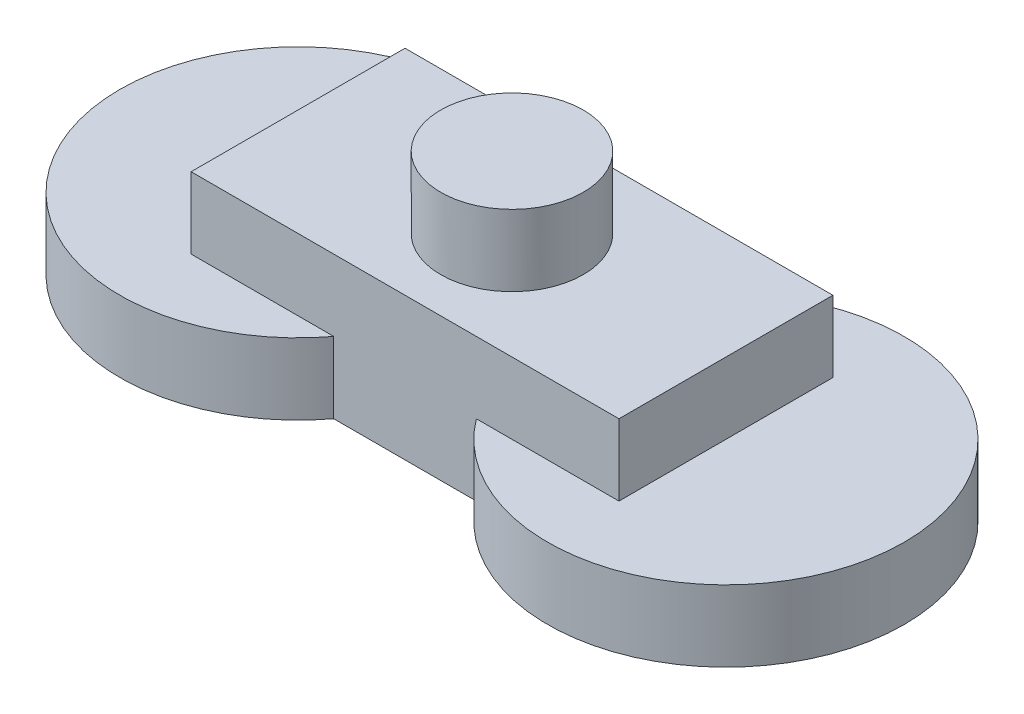
ISO-10303-21;
HEADER;
FILE_DESCRIPTION(('STEP AP214'),'2;1');
FILE_NAME('part.step','',(''),(''),'','','');
FILE_SCHEMA(('AUTOMOTIVE_DESIGN { 1 0 10303 214 1 1 1 1 }'));
ENDSEC;
DATA;
#1=APPLICATION_CONTEXT('core data for automotive mechanical design processes');
#2=APPLICATION_PROTOCOL_DEFINITION('international standard','automotive_design',2000,#1);
#3=PRODUCT_CONTEXT('',#1,'mechanical');
#4=PRODUCT('Part','Part','',(#3));
#5=PRODUCT_RELATED_PRODUCT_CATEGORY('part','',(#4));
#6=PRODUCT_DEFINITION_FORMATION('','',#4);
#7=PRODUCT_DEFINITION_CONTEXT('part definition',#1,'design');
#8=PRODUCT_DEFINITION('design','',#6,#7);
#9=PRODUCT_DEFINITION_SHAPE('','',#8);
#10=(LENGTH_UNIT() NAMED_UNIT(*) SI_UNIT(.MILLI.,.METRE.));
#11=(NAMED_UNIT(*) PLANE_ANGLE_UNIT() SI_UNIT($,.RADIAN.));
#12=(NAMED_UNIT(*) SI_UNIT($,.STERADIAN.) SOLID_ANGLE_UNIT());
#13=UNCERTAINTY_MEASURE_WITH_UNIT(LENGTH_MEASURE(1.E-05),#10,'distance_accuracy_value','');
#14=(GEOMETRIC_REPRESENTATION_CONTEXT(3) GLOBAL_UNCERTAINTY_ASSIGNED_CONTEXT((#13)) GLOBAL_UNIT_ASSIGNED_CONTEXT((#10,
#11,#12)) REPRESENTATION_CONTEXT('',''));
#15=CARTESIAN_POINT('',(0.,0.,0.));
#16=DIRECTION('',(0.,0.,1.));
#17=DIRECTION('',(1.,0.,0.));
#18=AXIS2_PLACEMENT_3D('',#15,#16,#17);
#19=CARTESIAN_POINT('',(0.,20.,38.6286001339585));
#20=DIRECTION('',(0.,0.,1.));
#21=DIRECTION('',(1.,0.,0.));
#22=AXIS2_PLACEMENT_3D('',#19,#20,#21);
#23=PLANE('',#22);
#24=DIRECTION('',(-1.,0.,0.));
#25=VECTOR('',#24,1.);
#26=CARTESIAN_POINT('',(0.,10.,38.6286001339585));
#27=LINE('',#26,#25);
#28=CARTESIAN_POINT('',(-19.3107836570663,10.,38.6286001339585));
#29=VERTEX_POINT('',#28);
#30=CARTESIAN_POINT('',(-39.3107836570663,10.,38.6286001339585));
#31=VERTEX_POINT('',#30);
#32=EDGE_CURVE('E108',#29,#31,#27,.T.);
#33=ORIENTED_EDGE('',*,*,#32,.F.);
#34=DIRECTION('',(0.,-1.,0.));
#35=VECTOR('',#34,1.);
#36=CARTESIAN_POINT('',(-19.3107836570663,10.,38.6286001339585));
#37=LINE('',#36,#35);
#38=CARTESIAN_POINT('',(-19.3107836570663,0.,38.6286001339585));
#39=VERTEX_POINT('',#38);
#40=EDGE_CURVE('E105',#29,#39,#37,.T.);
#41=ORIENTED_EDGE('',*,*,#40,.T.);
#42=DIRECTION('',(-1.,0.,0.));
#43=VECTOR('',#42,1.);
#44=CARTESIAN_POINT('',(0.,0.,38.6286001339585));
#45=LINE('',#44,#43);
#46=CARTESIAN_POINT('',(0.689216342933684,0.,38.6286001339585));
#47=VERTEX_POINT('',#46);
#48=EDGE_CURVE('E121',#47,#39,#45,.T.);
#49=ORIENTED_EDGE('',*,*,#48,.F.);
#50=DIRECTION('',(0.,-1.,0.));
#51=VECTOR('',#50,1.);
#52=CARTESIAN_POINT('',(0.689216342933684,10.,38.6286001339585));
#53=LINE('',#52,#51);
#54=CARTESIAN_POINT('',(0.689216342933684,10.,38.6286001339585));
#55=VERTEX_POINT('',#54);
#56=EDGE_CURVE('E11',#55,#47,#53,.T.);
#57=ORIENTED_EDGE('',*,*,#56,.F.);
#58=DIRECTION('',(-1.,0.,0.));
#59=VECTOR('',#58,1.);
#60=CARTESIAN_POINT('',(0.,10.,38.6286001339585));
#61=LINE('',#60,#59);
#62=CARTESIAN_POINT('',(20.6892163429337,10.,38.6286001339585));
#63=VERTEX_POINT('',#62);
#64=EDGE_CURVE('E155',#63,#55,#61,.T.);
#65=ORIENTED_EDGE('',*,*,#64,.F.);
#66=DIRECTION('',(0.,-1.,0.));
#67=VECTOR('',#66,1.);
#68=CARTESIAN_POINT('',(20.6892163429337,20.,38.6286001339585));
#69=LINE('',#68,#67);
#70=CARTESIAN_POINT('',(20.6892163429337,20.,38.6286001339585));
#71=VERTEX_POINT('',#70);
#72=EDGE_CURVE('E148',#71,#63,#69,.T.);
#73=ORIENTED_EDGE('',*,*,#72,.F.);
#74=DIRECTION('',(-1.,0.,0.));
#75=VECTOR('',#74,1.);
#76=CARTESIAN_POINT('',(0.,20.,38.6286001339585));
#77=LINE('',#76,#75);
#78=CARTESIAN_POINT('',(-39.3107836570663,20.,38.6286001339585));
#79=VERTEX_POINT('',#78);
#80=EDGE_CURVE('E134',#71,#79,#77,.T.);
#81=ORIENTED_EDGE('',*,*,#80,.T.);
#82=DIRECTION('',(0.,-1.,0.));
#83=VECTOR('',#82,1.);
#84=CARTESIAN_POINT('',(-39.3107836570663,20.,38.6286001339585));
#85=LINE('',#84,#83);
#86=EDGE_CURVE('E151',#79,#31,#85,.T.);
#87=ORIENTED_EDGE('',*,*,#86,.T.);
#88=EDGE_LOOP('',(#33,#41,#49,#57,#65,#73,#81,#87));
#89=FACE_BOUND('',#88,.T.);
#90=ADVANCED_FACE('F35',(#89),#23,.T.);
#91=CARTESIAN_POINT('',(0.,20.,8.62860013395847));
#92=DIRECTION('',(0.,0.,1.));
#93=DIRECTION('',(1.,0.,0.));
#94=AXIS2_PLACEMENT_3D('',#91,#92,#93);
#95=PLANE('',#94);
#96=DIRECTION('',(0.,-1.,0.));
#97=VECTOR('',#96,1.);
#98=CARTESIAN_POINT('',(-19.3107836570663,10.,8.62860013395847));
#99=LINE('',#98,#97);
#100=CARTESIAN_POINT('',(-19.3107836570663,10.,8.62860013395847));
#101=VERTEX_POINT('',#100);
#102=CARTESIAN_POINT('',(-19.3107836570663,0.,8.62860013395847));
#103=VERTEX_POINT('',#102);
#104=EDGE_CURVE('E103',#101,#103,#99,.T.);
#105=ORIENTED_EDGE('',*,*,#104,.F.);
#106=DIRECTION('',(-1.,0.,0.));
#107=VECTOR('',#106,1.);
#108=CARTESIAN_POINT('',(0.,10.,8.62860013395847));
#109=LINE('',#108,#107);
#110=CARTESIAN_POINT('',(-39.3107836570663,10.,8.62860013395847));
#111=VERTEX_POINT('',#110);
#112=EDGE_CURVE('E109',#101,#111,#109,.T.);
#113=ORIENTED_EDGE('',*,*,#112,.T.);
#114=DIRECTION('',(0.,-1.,0.));
#115=VECTOR('',#114,1.);
#116=CARTESIAN_POINT('',(-39.3107836570663,20.,8.62860013395847));
#117=LINE('',#116,#115);
#118=CARTESIAN_POINT('',(-39.3107836570663,20.,8.62860013395847));
#119=VERTEX_POINT('',#118);
#120=EDGE_CURVE('E141',#119,#111,#117,.T.);
#121=ORIENTED_EDGE('',*,*,#120,.F.);
#122=DIRECTION('',(-1.,0.,0.));
#123=VECTOR('',#122,1.);
#124=CARTESIAN_POINT('',(0.,20.,8.62860013395847));
#125=LINE('',#124,#123);
#126=CARTESIAN_POINT('',(20.6892163429337,20.,8.62860013395847));
#127=VERTEX_POINT('',#126);
#128=EDGE_CURVE('E140',#127,#119,#125,.T.);
#129=ORIENTED_EDGE('',*,*,#128,.F.);
#130=DIRECTION('',(0.,-1.,0.));
#131=VECTOR('',#130,1.);
#132=CARTESIAN_POINT('',(20.6892163429337,20.,8.62860013395847));
#133=LINE('',#132,#131);
#134=CARTESIAN_POINT('',(20.6892163429337,10.,8.62860013395847));
#135=VERTEX_POINT('',#134);
#136=EDGE_CURVE('E145',#127,#135,#133,.T.);
#137=ORIENTED_EDGE('',*,*,#136,.T.);
#138=DIRECTION('',(-1.,0.,0.));
#139=VECTOR('',#138,1.);
#140=CARTESIAN_POINT('',(0.,10.,8.62860013395847));
#141=LINE('',#140,#139);
#142=CARTESIAN_POINT('',(0.689216342933684,10.,8.62860013395847));
#143=VERTEX_POINT('',#142);
#144=EDGE_CURVE('E161',#135,#143,#141,.T.);
#145=ORIENTED_EDGE('',*,*,#144,.T.);
#146=DIRECTION('',(0.,-1.,0.));
#147=VECTOR('',#146,1.);
#148=CARTESIAN_POINT('',(0.689216342933684,10.,8.62860013395847));
#149=LINE('',#148,#147);
#150=CARTESIAN_POINT('',(0.689216342933684,0.,8.62860013395847));
#151=VERTEX_POINT('',#150);
#152=EDGE_CURVE('E43',#143,#151,#149,.T.);
#153=ORIENTED_EDGE('',*,*,#152,.T.);
#154=DIRECTION('',(-1.,0.,0.));
#155=VECTOR('',#154,1.);
#156=CARTESIAN_POINT('',(0.,0.,8.62860013395847));
#157=LINE('',#156,#155);
#158=EDGE_CURVE('E50',#151,#103,#157,.T.);
#159=ORIENTED_EDGE('',*,*,#158,.T.);
#160=EDGE_LOOP('',(#105,#113,#121,#129,#137,#145,#153,#159));
#161=FACE_BOUND('',#160,.T.);
#162=ADVANCED_FACE('F120',(#161),#95,.F.);
#163=CARTESIAN_POINT('',(20.6892163429337,10.,23.6286001339585));
#164=DIRECTION('',(0.,-1.,0.));
#165=DIRECTION('',(0.,0.,-1.));
#166=AXIS2_PLACEMENT_3D('',#163,#164,#165);
#167=CYLINDRICAL_SURFACE('',#166,25.);
#168=CARTESIAN_POINT('',(20.6892163429337,0.,23.6286001339585));
#169=DIRECTION('',(0.,1.,0.));
#170=DIRECTION('',(0.,0.,1.));
#171=AXIS2_PLACEMENT_3D('',#168,#169,#170);
#172=CIRCLE('',#171,25.);
#173=EDGE_CURVE('E154',#47,#151,#172,.T.);
#174=ORIENTED_EDGE('',*,*,#173,.T.);
#175=ORIENTED_EDGE('',*,*,#152,.F.);
#176=CARTESIAN_POINT('',(20.6892163429337,10.,23.6286001339585));
#177=DIRECTION('',(0.,1.,0.));
#178=DIRECTION('',(0.,0.,1.));
#179=AXIS2_PLACEMENT_3D('',#176,#177,#178);
#180=CIRCLE('',#179,25.);
#181=EDGE_CURVE('E158',#55,#143,#180,.T.);
#182=ORIENTED_EDGE('',*,*,#181,.F.);
#183=ORIENTED_EDGE('',*,*,#56,.T.);
#184=EDGE_LOOP('',(#174,#175,#182,#183));
#185=FACE_BOUND('',#184,.T.);
#186=ADVANCED_FACE('F37',(#185),#167,.T.);
#187=CARTESIAN_POINT('',(0.,10.,0.));
#188=DIRECTION('',(0.,1.,0.));
#189=DIRECTION('',(0.,0.,1.));
#190=AXIS2_PLACEMENT_3D('',#187,#188,#189);
#191=PLANE('',#190);
#192=ORIENTED_EDGE('',*,*,#64,.T.);
#193=ORIENTED_EDGE('',*,*,#181,.T.);
#194=ORIENTED_EDGE('',*,*,#144,.F.);
#195=DIRECTION('',(0.,0.,-1.));
#196=VECTOR('',#195,1.);
#197=CARTESIAN_POINT('',(20.6892163429337,10.,0.));
#198=LINE('',#197,#196);
#199=EDGE_CURVE('E163',#63,#135,#198,.T.);
#200=ORIENTED_EDGE('',*,*,#199,.F.);
#201=EDGE_LOOP('',(#192,#193,#194,#200));
#202=FACE_BOUND('',#201,.T.);
#203=ADVANCED_FACE('F202',(#202),#191,.T.);
#204=CARTESIAN_POINT('',(0.,0.,0.));
#205=DIRECTION('',(0.,1.,0.));
#206=DIRECTION('',(0.,0.,1.));
#207=AXIS2_PLACEMENT_3D('',#204,#205,#206);
#208=PLANE('',#207);
#209=ORIENTED_EDGE('',*,*,#173,.F.);
#210=ORIENTED_EDGE('',*,*,#48,.T.);
#211=CARTESIAN_POINT('',(-39.3107836570663,0.,23.6286001339585));
#212=DIRECTION('',(0.,1.,0.));
#213=DIRECTION('',(0.,0.,1.));
#214=AXIS2_PLACEMENT_3D('',#211,#212,#213);
#215=CIRCLE('',#214,25.);
#216=EDGE_CURVE('E118',#103,#39,#215,.T.);
#217=ORIENTED_EDGE('',*,*,#216,.F.);
#218=ORIENTED_EDGE('',*,*,#158,.F.);
#219=EDGE_LOOP('',(#209,#210,#217,#218));
#220=FACE_BOUND('',#219,.T.);
#221=ADVANCED_FACE('F169',(#220),#208,.F.);
#222=CARTESIAN_POINT('',(-39.3107836570663,20.,0.));
#223=DIRECTION('',(-1.,0.,0.));
#224=DIRECTION('',(0.,0.,1.));
#225=AXIS2_PLACEMENT_3D('',#222,#223,#224);
#226=PLANE('',#225);
#227=DIRECTION('',(0.,0.,-1.));
#228=VECTOR('',#227,1.);
#229=CARTESIAN_POINT('',(-39.3107836570663,10.,0.));
#230=LINE('',#229,#228);
#231=EDGE_CURVE('E114',#31,#111,#230,.T.);
#232=ORIENTED_EDGE('',*,*,#231,.F.);
#233=ORIENTED_EDGE('',*,*,#86,.F.);
#234=DIRECTION('',(0.,0.,-1.));
#235=VECTOR('',#234,1.);
#236=CARTESIAN_POINT('',(-39.3107836570663,20.,0.));
#237=LINE('',#236,#235);
#238=EDGE_CURVE('E131',#79,#119,#237,.T.);
#239=ORIENTED_EDGE('',*,*,#238,.T.);
#240=ORIENTED_EDGE('',*,*,#120,.T.);
#241=EDGE_LOOP('',(#232,#233,#239,#240));
#242=FACE_BOUND('',#241,.T.);
#243=ADVANCED_FACE('F198',(#242),#226,.T.);
#244=CARTESIAN_POINT('',(20.6892163429337,20.,0.));
#245=DIRECTION('',(-1.,0.,0.));
#246=DIRECTION('',(0.,0.,1.));
#247=AXIS2_PLACEMENT_3D('',#244,#245,#246);
#248=PLANE('',#247);
#249=ORIENTED_EDGE('',*,*,#199,.T.);
#250=ORIENTED_EDGE('',*,*,#136,.F.);
#251=DIRECTION('',(0.,0.,-1.));
#252=VECTOR('',#251,1.);
#253=CARTESIAN_POINT('',(20.6892163429337,20.,0.));
#254=LINE('',#253,#252);
#255=EDGE_CURVE('E137',#71,#127,#254,.T.);
#256=ORIENTED_EDGE('',*,*,#255,.F.);
#257=ORIENTED_EDGE('',*,*,#72,.T.);
#258=EDGE_LOOP('',(#249,#250,#256,#257));
#259=FACE_BOUND('',#258,.T.);
#260=ADVANCED_FACE('F197',(#259),#248,.F.);
#261=CARTESIAN_POINT('',(0.,20.,0.));
#262=DIRECTION('',(0.,1.,0.));
#263=DIRECTION('',(0.,0.,1.));
#264=AXIS2_PLACEMENT_3D('',#261,#262,#263);
#265=PLANE('',#264);
#266=CARTESIAN_POINT('',(-9.31078365706631,20.,23.6286001339585));
#267=DIRECTION('',(0.,1.,0.));
#268=DIRECTION('',(0.,0.,1.));
#269=AXIS2_PLACEMENT_3D('',#266,#267,#268);
#270=CIRCLE('',#269,10.);
#271=CARTESIAN_POINT('',(-9.31078365706631,20.,33.6286001339585));
#272=VERTEX_POINT('',#271);
#273=EDGE_CURVE('E128',#272,#272,#270,.T.);
#274=ORIENTED_EDGE('',*,*,#273,.F.);
#275=EDGE_LOOP('',(#274));
#276=FACE_BOUND('',#275,.T.);
#277=ORIENTED_EDGE('',*,*,#238,.F.);
#278=ORIENTED_EDGE('',*,*,#80,.F.);
#279=ORIENTED_EDGE('',*,*,#255,.T.);
#280=ORIENTED_EDGE('',*,*,#128,.T.);
#281=EDGE_LOOP('',(#277,#278,#279,#280));
#282=FACE_BOUND('',#281,.T.);
#283=ADVANCED_FACE('F222',(#276,#282),#265,.T.);
#284=CARTESIAN_POINT('',(-39.3107836570663,10.,23.6286001339585));
#285=DIRECTION('',(0.,-1.,0.));
#286=DIRECTION('',(0.,0.,-1.));
#287=AXIS2_PLACEMENT_3D('',#284,#285,#286);
#288=CYLINDRICAL_SURFACE('',#287,25.);
#289=ORIENTED_EDGE('',*,*,#216,.T.);
#290=ORIENTED_EDGE('',*,*,#40,.F.);
#291=CARTESIAN_POINT('',(-39.3107836570663,10.,23.6286001339585));
#292=DIRECTION('',(0.,1.,0.));
#293=DIRECTION('',(0.,0.,1.));
#294=AXIS2_PLACEMENT_3D('',#291,#292,#293);
#295=CIRCLE('',#294,25.);
#296=EDGE_CURVE('E99',#101,#29,#295,.T.);
#297=ORIENTED_EDGE('',*,*,#296,.F.);
#298=ORIENTED_EDGE('',*,*,#104,.T.);
#299=EDGE_LOOP('',(#289,#290,#297,#298));
#300=FACE_BOUND('',#299,.T.);
#301=ADVANCED_FACE('F101',(#300),#288,.T.);
#302=CARTESIAN_POINT('',(0.,10.,0.));
#303=DIRECTION('',(0.,1.,0.));
#304=DIRECTION('',(0.,0.,1.));
#305=AXIS2_PLACEMENT_3D('',#302,#303,#304);
#306=PLANE('',#305);
#307=ORIENTED_EDGE('',*,*,#112,.F.);
#308=ORIENTED_EDGE('',*,*,#296,.T.);
#309=ORIENTED_EDGE('',*,*,#32,.T.);
#310=ORIENTED_EDGE('',*,*,#231,.T.);
#311=EDGE_LOOP('',(#307,#308,#309,#310));
#312=FACE_BOUND('',#311,.T.);
#313=ADVANCED_FACE('F112',(#312),#306,.T.);
#314=CARTESIAN_POINT('',(-9.31078365706631,30.,23.6286001339585));
#315=DIRECTION('',(0.,-1.,0.));
#316=DIRECTION('',(0.,0.,-1.));
#317=AXIS2_PLACEMENT_3D('',#314,#315,#316);
#318=PLANE('',#317);
#319=CARTESIAN_POINT('',(-9.31078365706631,30.,23.6286001339585));
#320=DIRECTION('',(0.,-1.,0.));
#321=DIRECTION('',(0.,0.,-1.));
#322=AXIS2_PLACEMENT_3D('',#319,#320,#321);
#323=CIRCLE('',#322,10.);
#324=CARTESIAN_POINT('',(-9.31078365706631,30.,13.6286001339585));
#325=VERTEX_POINT('',#324);
#326=EDGE_CURVE('E172',#325,#325,#323,.T.);
#327=ORIENTED_EDGE('',*,*,#326,.F.);
#328=EDGE_LOOP('',(#327));
#329=FACE_BOUND('',#328,.T.);
#330=ADVANCED_FACE('F179',(#329),#318,.F.);
#331=CARTESIAN_POINT('',(-9.31078365706631,30.,23.6286001339585));
#332=DIRECTION('',(0.,-1.,0.));
#333=DIRECTION('',(0.,0.,-1.));
#334=AXIS2_PLACEMENT_3D('',#331,#332,#333);
#335=CYLINDRICAL_SURFACE('',#334,10.);
#336=ORIENTED_EDGE('',*,*,#273,.T.);
#337=EDGE_LOOP('',(#336));
#338=FACE_BOUND('',#337,.T.);
#339=ORIENTED_EDGE('',*,*,#326,.T.);
#340=EDGE_LOOP('',(#339));
#341=FACE_BOUND('',#340,.T.);
#342=ADVANCED_FACE('F177',(#338,#341),#335,.T.);
#343=CLOSED_SHELL('',(#90,#162,#186,#203,#221,#243,#260,#283,#301,#313,#330,#342));
#344=MANIFOLD_SOLID_BREP('B2',#343);
#345=ADVANCED_BREP_SHAPE_REPRESENTATION('',(#18,#344),#14);
#346=SHAPE_DEFINITION_REPRESENTATION(#9,#345);
ENDSEC;
END-ISO-10303-21;
